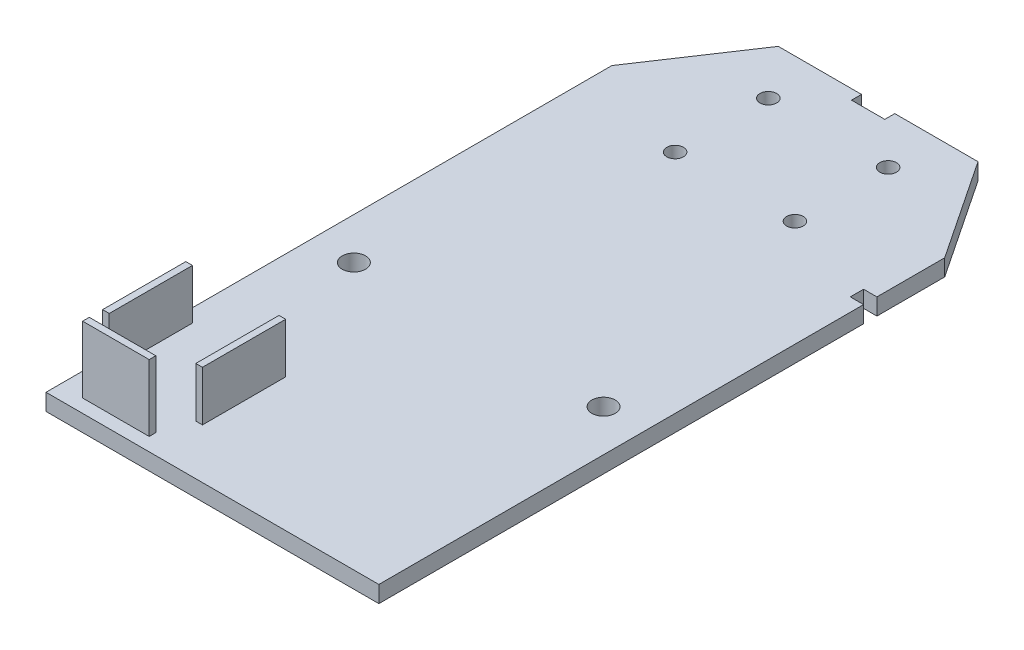
ISO-10303-21;
HEADER;
FILE_DESCRIPTION(('STEP AP214'),'2;1');
FILE_NAME('part.step','',(''),(''),'','','');
FILE_SCHEMA(('AUTOMOTIVE_DESIGN { 1 0 10303 214 1 1 1 1 }'));
ENDSEC;
DATA;
#1=APPLICATION_CONTEXT('core data for automotive mechanical design processes');
#2=APPLICATION_PROTOCOL_DEFINITION('international standard','automotive_design',2000,#1);
#3=PRODUCT_CONTEXT('',#1,'mechanical');
#4=PRODUCT('Part','Part','',(#3));
#5=PRODUCT_RELATED_PRODUCT_CATEGORY('part','',(#4));
#6=PRODUCT_DEFINITION_FORMATION('','',#4);
#7=PRODUCT_DEFINITION_CONTEXT('part definition',#1,'design');
#8=PRODUCT_DEFINITION('design','',#6,#7);
#9=PRODUCT_DEFINITION_SHAPE('','',#8);
#10=(LENGTH_UNIT() NAMED_UNIT(*) SI_UNIT(.MILLI.,.METRE.));
#11=(NAMED_UNIT(*) PLANE_ANGLE_UNIT() SI_UNIT($,.RADIAN.));
#12=(NAMED_UNIT(*) SI_UNIT($,.STERADIAN.) SOLID_ANGLE_UNIT());
#13=UNCERTAINTY_MEASURE_WITH_UNIT(LENGTH_MEASURE(1.E-05),#10,'distance_accuracy_value','');
#14=(GEOMETRIC_REPRESENTATION_CONTEXT(3) GLOBAL_UNCERTAINTY_ASSIGNED_CONTEXT((#13)) GLOBAL_UNIT_ASSIGNED_CONTEXT((#10,
#11,#12)) REPRESENTATION_CONTEXT('',''));
#15=CARTESIAN_POINT('',(0.,0.,0.));
#16=DIRECTION('',(0.,0.,1.));
#17=DIRECTION('',(1.,0.,0.));
#18=AXIS2_PLACEMENT_3D('',#15,#16,#17);
#19=CARTESIAN_POINT('',(7.,25.,-6.));
#20=DIRECTION('',(1.,0.,0.));
#21=DIRECTION('',(0.,0.,-1.));
#22=AXIS2_PLACEMENT_3D('',#19,#20,#21);
#23=PLANE('',#22);
#24=DIRECTION('',(0.,0.,1.));
#25=VECTOR('',#24,1.);
#26=CARTESIAN_POINT('',(7.,5.,-6.));
#27=LINE('',#26,#25);
#28=CARTESIAN_POINT('',(7.,5.,-6.));
#29=VERTEX_POINT('',#28);
#30=CARTESIAN_POINT('',(7.,5.,-4.));
#31=VERTEX_POINT('',#30);
#32=EDGE_CURVE('E106',#29,#31,#27,.T.);
#33=ORIENTED_EDGE('',*,*,#32,.T.);
#34=DIRECTION('',(0.,-1.,0.));
#35=VECTOR('',#34,1.);
#36=CARTESIAN_POINT('',(7.,25.,-4.));
#37=LINE('',#36,#35);
#38=CARTESIAN_POINT('',(7.,25.,-4.));
#39=VERTEX_POINT('',#38);
#40=EDGE_CURVE('E12',#39,#31,#37,.T.);
#41=ORIENTED_EDGE('',*,*,#40,.F.);
#42=DIRECTION('',(0.,0.,1.));
#43=VECTOR('',#42,1.);
#44=CARTESIAN_POINT('',(7.,25.,-6.));
#45=LINE('',#44,#43);
#46=CARTESIAN_POINT('',(7.,25.,-6.));
#47=VERTEX_POINT('',#46);
#48=EDGE_CURVE('E94',#47,#39,#45,.T.);
#49=ORIENTED_EDGE('',*,*,#48,.F.);
#50=DIRECTION('',(0.,-1.,0.));
#51=VECTOR('',#50,1.);
#52=CARTESIAN_POINT('',(7.,25.,-6.));
#53=LINE('',#52,#51);
#54=EDGE_CURVE('E102',#47,#29,#53,.T.);
#55=ORIENTED_EDGE('',*,*,#54,.T.);
#56=EDGE_LOOP('',(#33,#41,#49,#55));
#57=FACE_BOUND('',#56,.T.);
#58=ADVANCED_FACE('F43',(#57),#23,.F.);
#59=CARTESIAN_POINT('',(7.,25.,-4.));
#60=DIRECTION('',(0.,0.,-1.));
#61=DIRECTION('',(-1.,0.,0.));
#62=AXIS2_PLACEMENT_3D('',#59,#60,#61);
#63=PLANE('',#62);
#64=DIRECTION('',(1.,0.,0.));
#65=VECTOR('',#64,1.);
#66=CARTESIAN_POINT('',(7.,5.,-4.));
#67=LINE('',#66,#65);
#68=CARTESIAN_POINT('',(27.,5.,-4.));
#69=VERTEX_POINT('',#68);
#70=EDGE_CURVE('E98',#31,#69,#67,.T.);
#71=ORIENTED_EDGE('',*,*,#70,.T.);
#72=DIRECTION('',(0.,-1.,0.));
#73=VECTOR('',#72,1.);
#74=CARTESIAN_POINT('',(27.,25.,-4.));
#75=LINE('',#74,#73);
#76=CARTESIAN_POINT('',(27.,25.,-4.));
#77=VERTEX_POINT('',#76);
#78=EDGE_CURVE('E51',#77,#69,#75,.T.);
#79=ORIENTED_EDGE('',*,*,#78,.F.);
#80=DIRECTION('',(1.,0.,0.));
#81=VECTOR('',#80,1.);
#82=CARTESIAN_POINT('',(7.,25.,-4.));
#83=LINE('',#82,#81);
#84=EDGE_CURVE('E89',#39,#77,#83,.T.);
#85=ORIENTED_EDGE('',*,*,#84,.F.);
#86=ORIENTED_EDGE('',*,*,#40,.T.);
#87=EDGE_LOOP('',(#71,#79,#85,#86));
#88=FACE_BOUND('',#87,.T.);
#89=ADVANCED_FACE('F97',(#88),#63,.F.);
#90=CARTESIAN_POINT('',(27.,25.,-4.));
#91=DIRECTION('',(-1.,0.,0.));
#92=DIRECTION('',(0.,0.,1.));
#93=AXIS2_PLACEMENT_3D('',#90,#91,#92);
#94=PLANE('',#93);
#95=DIRECTION('',(0.,0.,-1.));
#96=VECTOR('',#95,1.);
#97=CARTESIAN_POINT('',(27.,5.,-4.));
#98=LINE('',#97,#96);
#99=CARTESIAN_POINT('',(27.,5.,-6.));
#100=VERTEX_POINT('',#99);
#101=EDGE_CURVE('E76',#69,#100,#98,.T.);
#102=ORIENTED_EDGE('',*,*,#101,.T.);
#103=DIRECTION('',(0.,-1.,0.));
#104=VECTOR('',#103,1.);
#105=CARTESIAN_POINT('',(27.,25.,-6.));
#106=LINE('',#105,#104);
#107=CARTESIAN_POINT('',(27.,25.,-6.));
#108=VERTEX_POINT('',#107);
#109=EDGE_CURVE('E99',#108,#100,#106,.T.);
#110=ORIENTED_EDGE('',*,*,#109,.F.);
#111=DIRECTION('',(0.,0.,-1.));
#112=VECTOR('',#111,1.);
#113=CARTESIAN_POINT('',(27.,25.,-4.));
#114=LINE('',#113,#112);
#115=EDGE_CURVE('E92',#77,#108,#114,.T.);
#116=ORIENTED_EDGE('',*,*,#115,.F.);
#117=ORIENTED_EDGE('',*,*,#78,.T.);
#118=EDGE_LOOP('',(#102,#110,#116,#117));
#119=FACE_BOUND('',#118,.T.);
#120=ADVANCED_FACE('F100',(#119),#94,.F.);
#121=CARTESIAN_POINT('',(27.,25.,-6.));
#122=DIRECTION('',(0.,0.,1.));
#123=DIRECTION('',(1.,0.,0.));
#124=AXIS2_PLACEMENT_3D('',#121,#122,#123);
#125=PLANE('',#124);
#126=DIRECTION('',(-1.,0.,0.));
#127=VECTOR('',#126,1.);
#128=CARTESIAN_POINT('',(27.,5.,-6.));
#129=LINE('',#128,#127);
#130=EDGE_CURVE('E82',#100,#29,#129,.T.);
#131=ORIENTED_EDGE('',*,*,#130,.T.);
#132=ORIENTED_EDGE('',*,*,#54,.F.);
#133=DIRECTION('',(-1.,0.,0.));
#134=VECTOR('',#133,1.);
#135=CARTESIAN_POINT('',(27.,25.,-6.));
#136=LINE('',#135,#134);
#137=EDGE_CURVE('E59',#108,#47,#136,.T.);
#138=ORIENTED_EDGE('',*,*,#137,.F.);
#139=ORIENTED_EDGE('',*,*,#109,.T.);
#140=EDGE_LOOP('',(#131,#132,#138,#139));
#141=FACE_BOUND('',#140,.T.);
#142=ADVANCED_FACE('F113',(#141),#125,.F.);
#143=CARTESIAN_POINT('',(0.,25.,0.));
#144=DIRECTION('',(0.,1.,0.));
#145=DIRECTION('',(0.,0.,1.));
#146=AXIS2_PLACEMENT_3D('',#143,#144,#145);
#147=PLANE('',#146);
#148=ORIENTED_EDGE('',*,*,#48,.T.);
#149=ORIENTED_EDGE('',*,*,#84,.T.);
#150=ORIENTED_EDGE('',*,*,#115,.T.);
#151=ORIENTED_EDGE('',*,*,#137,.T.);
#152=EDGE_LOOP('',(#148,#149,#150,#151));
#153=FACE_BOUND('',#152,.T.);
#154=ADVANCED_FACE('F90',(#153),#147,.T.);
#155=CARTESIAN_POINT('',(0.,5.,0.));
#156=DIRECTION('',(0.,1.,0.));
#157=DIRECTION('',(0.,0.,1.));
#158=AXIS2_PLACEMENT_3D('',#155,#156,#157);
#159=PLANE('',#158);
#160=ORIENTED_EDGE('',*,*,#32,.F.);
#161=ORIENTED_EDGE('',*,*,#130,.F.);
#162=ORIENTED_EDGE('',*,*,#101,.F.);
#163=ORIENTED_EDGE('',*,*,#70,.F.);
#164=EDGE_LOOP('',(#160,#161,#162,#163));
#165=FACE_BOUND('',#164,.T.);
#166=ADVANCED_FACE('F116',(#165),#159,.F.);
#167=CLOSED_SHELL('',(#58,#89,#120,#142,#154,#166));
#168=MANIFOLD_SOLID_BREP('B2',#167);
#169=CARTESIAN_POINT('',(0.,5.,0.));
#170=DIRECTION('',(0.,1.,0.));
#171=DIRECTION('',(0.,0.,1.));
#172=AXIS2_PLACEMENT_3D('',#169,#170,#171);
#173=PLANE('',#172);
#174=DIRECTION('',(1.,0.,0.));
#175=VECTOR('',#174,1.);
#176=CARTESIAN_POINT('',(96.,5.,-145.627138926997));
#177=LINE('',#176,#175);
#178=CARTESIAN_POINT('',(96.,5.,-145.627138926997));
#179=VERTEX_POINT('',#178);
#180=CARTESIAN_POINT('',(100.,5.,-145.627138926997));
#181=VERTEX_POINT('',#180);
#182=EDGE_CURVE('E377',#179,#181,#177,.T.);
#183=ORIENTED_EDGE('',*,*,#182,.F.);
#184=DIRECTION('',(0.,0.,1.));
#185=VECTOR('',#184,1.);
#186=CARTESIAN_POINT('',(96.,5.,-149.627138926997));
#187=LINE('',#186,#185);
#188=CARTESIAN_POINT('',(96.,5.,-149.627138926997));
#189=VERTEX_POINT('',#188);
#190=EDGE_CURVE('E386',#189,#179,#187,.T.);
#191=ORIENTED_EDGE('',*,*,#190,.F.);
#192=DIRECTION('',(-1.,0.,0.));
#193=VECTOR('',#192,1.);
#194=CARTESIAN_POINT('',(100.,5.,-149.627138926997));
#195=LINE('',#194,#193);
#196=CARTESIAN_POINT('',(100.,5.,-149.627138926997));
#197=VERTEX_POINT('',#196);
#198=EDGE_CURVE('E372',#197,#189,#195,.T.);
#199=ORIENTED_EDGE('',*,*,#198,.F.);
#200=DIRECTION('',(0.,0.,-1.));
#201=VECTOR('',#200,1.);
#202=CARTESIAN_POINT('',(100.,5.,0.));
#203=LINE('',#202,#201);
#204=CARTESIAN_POINT('',(100.,5.,-170.));
#205=VERTEX_POINT('',#204);
#206=EDGE_CURVE('E486',#197,#205,#203,.T.);
#207=ORIENTED_EDGE('',*,*,#206,.T.);
#208=DIRECTION('',(0.554700196225229,0.,0.832050294337843));
#209=VECTOR('',#208,1.);
#210=CARTESIAN_POINT('',(100.,5.,-170.));
#211=LINE('',#210,#209);
#212=CARTESIAN_POINT('',(80.,5.,-200.));
#213=VERTEX_POINT('',#212);
#214=EDGE_CURVE('E393',#213,#205,#211,.T.);
#215=ORIENTED_EDGE('',*,*,#214,.F.);
#216=DIRECTION('',(1.,0.,0.));
#217=VECTOR('',#216,1.);
#218=CARTESIAN_POINT('',(0.,5.,-200.));
#219=LINE('',#218,#217);
#220=CARTESIAN_POINT('',(55.,5.,-200.));
#221=VERTEX_POINT('',#220);
#222=EDGE_CURVE('E487',#221,#213,#219,.T.);
#223=ORIENTED_EDGE('',*,*,#222,.F.);
#224=DIRECTION('',(0.,0.,1.));
#225=VECTOR('',#224,1.);
#226=CARTESIAN_POINT('',(55.,5.,-200.));
#227=LINE('',#226,#225);
#228=CARTESIAN_POINT('',(55.,5.,-197.));
#229=VERTEX_POINT('',#228);
#230=EDGE_CURVE('E424',#221,#229,#227,.T.);
#231=ORIENTED_EDGE('',*,*,#230,.T.);
#232=DIRECTION('',(1.,0.,0.));
#233=VECTOR('',#232,1.);
#234=CARTESIAN_POINT('',(45.,5.,-197.));
#235=LINE('',#234,#233);
#236=CARTESIAN_POINT('',(45.,5.,-197.));
#237=VERTEX_POINT('',#236);
#238=EDGE_CURVE('E433',#237,#229,#235,.T.);
#239=ORIENTED_EDGE('',*,*,#238,.F.);
#240=DIRECTION('',(0.,0.,1.));
#241=VECTOR('',#240,1.);
#242=CARTESIAN_POINT('',(45.,5.,-200.));
#243=LINE('',#242,#241);
#244=CARTESIAN_POINT('',(45.,5.,-200.));
#245=VERTEX_POINT('',#244);
#246=EDGE_CURVE('E409',#245,#237,#243,.T.);
#247=ORIENTED_EDGE('',*,*,#246,.F.);
#248=CARTESIAN_POINT('',(20.,5.,-200.));
#249=VERTEX_POINT('',#248);
#250=EDGE_CURVE('E484',#249,#245,#219,.T.);
#251=ORIENTED_EDGE('',*,*,#250,.F.);
#252=DIRECTION('',(0.554700196225229,0.,-0.832050294337844));
#253=VECTOR('',#252,1.);
#254=CARTESIAN_POINT('',(0.,5.,-170.));
#255=LINE('',#254,#253);
#256=CARTESIAN_POINT('',(0.,5.,-170.));
#257=VERTEX_POINT('',#256);
#258=EDGE_CURVE('E403',#257,#249,#255,.T.);
#259=ORIENTED_EDGE('',*,*,#258,.F.);
#260=DIRECTION('',(0.,0.,-1.));
#261=VECTOR('',#260,1.);
#262=CARTESIAN_POINT('',(0.,5.,0.));
#263=LINE('',#262,#261);
#264=CARTESIAN_POINT('',(0.,5.,0.));
#265=VERTEX_POINT('',#264);
#266=EDGE_CURVE('E493',#265,#257,#263,.T.);
#267=ORIENTED_EDGE('',*,*,#266,.F.);
#268=DIRECTION('',(1.,0.,0.));
#269=VECTOR('',#268,1.);
#270=CARTESIAN_POINT('',(0.,5.,0.));
#271=LINE('',#270,#269);
#272=CARTESIAN_POINT('',(100.,5.,0.));
#273=VERTEX_POINT('',#272);
#274=EDGE_CURVE('E491',#265,#273,#271,.T.);
#275=ORIENTED_EDGE('',*,*,#274,.T.);
#276=EDGE_CURVE('E488',#273,#181,#203,.T.);
#277=ORIENTED_EDGE('',*,*,#276,.T.);
#278=EDGE_LOOP('',(#183,#191,#199,#207,#215,#223,#231,#239,#247,#251,#259,#267,#275,#277));
#279=FACE_BOUND('',#278,.T.);
#280=CARTESIAN_POINT('',(12.5,5.,-80.));
#281=DIRECTION('',(0.,1.,0.));
#282=DIRECTION('',(0.,0.,1.));
#283=AXIS2_PLACEMENT_3D('',#280,#281,#282);
#284=CIRCLE('',#283,3.5);
#285=CARTESIAN_POINT('',(12.5,5.,-76.5));
#286=VERTEX_POINT('',#285);
#287=EDGE_CURVE('E452',#286,#286,#284,.T.);
#288=ORIENTED_EDGE('',*,*,#287,.F.);
#289=EDGE_LOOP('',(#288));
#290=FACE_BOUND('',#289,.T.);
#291=CARTESIAN_POINT('',(87.5,5.,-80.));
#292=DIRECTION('',(0.,1.,0.));
#293=DIRECTION('',(0.,0.,1.));
#294=AXIS2_PLACEMENT_3D('',#291,#292,#293);
#295=CIRCLE('',#294,3.50000000000001);
#296=CARTESIAN_POINT('',(87.5,5.,-76.5));
#297=VERTEX_POINT('',#296);
#298=EDGE_CURVE('E441',#297,#297,#295,.T.);
#299=ORIENTED_EDGE('',*,*,#298,.F.);
#300=EDGE_LOOP('',(#299));
#301=FACE_BOUND('',#300,.T.);
#302=CARTESIAN_POINT('',(68.,5.,-185.));
#303=DIRECTION('',(0.,1.,0.));
#304=DIRECTION('',(0.,0.,1.));
#305=AXIS2_PLACEMENT_3D('',#302,#303,#304);
#306=CIRCLE('',#305,2.5);
#307=CARTESIAN_POINT('',(68.,5.,-182.5));
#308=VERTEX_POINT('',#307);
#309=EDGE_CURVE('E470',#308,#308,#306,.T.);
#310=ORIENTED_EDGE('',*,*,#309,.F.);
#311=EDGE_LOOP('',(#310));
#312=FACE_BOUND('',#311,.T.);
#313=CARTESIAN_POINT('',(32.,5.,-157.));
#314=DIRECTION('',(0.,1.,0.));
#315=DIRECTION('',(0.,0.,1.));
#316=AXIS2_PLACEMENT_3D('',#313,#314,#315);
#317=CIRCLE('',#316,2.5);
#318=CARTESIAN_POINT('',(32.,5.,-154.5));
#319=VERTEX_POINT('',#318);
#320=EDGE_CURVE('E463',#319,#319,#317,.T.);
#321=ORIENTED_EDGE('',*,*,#320,.F.);
#322=EDGE_LOOP('',(#321));
#323=FACE_BOUND('',#322,.T.);
#324=CARTESIAN_POINT('',(68.,5.,-157.));
#325=DIRECTION('',(0.,1.,0.));
#326=DIRECTION('',(0.,0.,1.));
#327=AXIS2_PLACEMENT_3D('',#324,#325,#326);
#328=CIRCLE('',#327,2.5);
#329=CARTESIAN_POINT('',(68.,5.,-154.5));
#330=VERTEX_POINT('',#329);
#331=EDGE_CURVE('E451',#330,#330,#328,.T.);
#332=ORIENTED_EDGE('',*,*,#331,.F.);
#333=EDGE_LOOP('',(#332));
#334=FACE_BOUND('',#333,.T.);
#335=CARTESIAN_POINT('',(32.,5.,-185.));
#336=DIRECTION('',(0.,1.,0.));
#337=DIRECTION('',(0.,0.,1.));
#338=AXIS2_PLACEMENT_3D('',#335,#336,#337);
#339=CIRCLE('',#338,2.5);
#340=CARTESIAN_POINT('',(32.,5.,-182.5));
#341=VERTEX_POINT('',#340);
#342=EDGE_CURVE('E469',#341,#341,#339,.T.);
#343=ORIENTED_EDGE('',*,*,#342,.F.);
#344=EDGE_LOOP('',(#343));
#345=FACE_BOUND('',#344,.T.);
#346=DIRECTION('',(0.,0.,-1.));
#347=VECTOR('',#346,1.);
#348=CARTESIAN_POINT('',(32.,5.,-40.));
#349=LINE('',#348,#347);
#350=CARTESIAN_POINT('',(32.,5.,-15.));
#351=VERTEX_POINT('',#350);
#352=CARTESIAN_POINT('',(32.,5.,-40.));
#353=VERTEX_POINT('',#352);
#354=EDGE_CURVE('E344',#351,#353,#349,.T.);
#355=ORIENTED_EDGE('',*,*,#354,.F.);
#356=DIRECTION('',(1.,0.,0.));
#357=VECTOR('',#356,1.);
#358=CARTESIAN_POINT('',(32.,5.,-15.));
#359=LINE('',#358,#357);
#360=CARTESIAN_POINT('',(30.,5.,-15.));
#361=VERTEX_POINT('',#360);
#362=EDGE_CURVE('E341',#361,#351,#359,.T.);
#363=ORIENTED_EDGE('',*,*,#362,.F.);
#364=DIRECTION('',(0.,0.,1.));
#365=VECTOR('',#364,1.);
#366=CARTESIAN_POINT('',(30.,5.,-15.));
#367=LINE('',#366,#365);
#368=CARTESIAN_POINT('',(30.,5.,-40.));
#369=VERTEX_POINT('',#368);
#370=EDGE_CURVE('E353',#369,#361,#367,.T.);
#371=ORIENTED_EDGE('',*,*,#370,.F.);
#372=DIRECTION('',(-1.,0.,0.));
#373=VECTOR('',#372,1.);
#374=CARTESIAN_POINT('',(30.,5.,-40.));
#375=LINE('',#374,#373);
#376=EDGE_CURVE('E361',#353,#369,#375,.T.);
#377=ORIENTED_EDGE('',*,*,#376,.F.);
#378=EDGE_LOOP('',(#355,#363,#371,#377));
#379=FACE_BOUND('',#378,.T.);
#380=DIRECTION('',(-1.,0.,0.));
#381=VECTOR('',#380,1.);
#382=CARTESIAN_POINT('',(4.,5.,-40.));
#383=LINE('',#382,#381);
#384=CARTESIAN_POINT('',(4.,5.,-40.));
#385=VERTEX_POINT('',#384);
#386=CARTESIAN_POINT('',(2.00000000000001,5.,-40.));
#387=VERTEX_POINT('',#386);
#388=EDGE_CURVE('E799',#385,#387,#383,.T.);
#389=ORIENTED_EDGE('',*,*,#388,.F.);
#390=DIRECTION('',(0.,0.,-1.));
#391=VECTOR('',#390,1.);
#392=CARTESIAN_POINT('',(4.,5.,-15.));
#393=LINE('',#392,#391);
#394=CARTESIAN_POINT('',(4.,5.,-15.));
#395=VERTEX_POINT('',#394);
#396=EDGE_CURVE('E339',#395,#385,#393,.T.);
#397=ORIENTED_EDGE('',*,*,#396,.F.);
#398=DIRECTION('',(1.,0.,0.));
#399=VECTOR('',#398,1.);
#400=CARTESIAN_POINT('',(2.,5.,-15.));
#401=LINE('',#400,#399);
#402=CARTESIAN_POINT('',(2.,5.,-15.));
#403=VERTEX_POINT('',#402);
#404=EDGE_CURVE('E335',#403,#395,#401,.T.);
#405=ORIENTED_EDGE('',*,*,#404,.F.);
#406=DIRECTION('',(0.,0.,1.));
#407=VECTOR('',#406,1.);
#408=CARTESIAN_POINT('',(2.00000000000001,5.,-40.));
#409=LINE('',#408,#407);
#410=EDGE_CURVE('E796',#387,#403,#409,.T.);
#411=ORIENTED_EDGE('',*,*,#410,.F.);
#412=EDGE_LOOP('',(#389,#397,#405,#411));
#413=FACE_BOUND('',#412,.T.);
#414=ADVANCED_FACE('F167',(#279,#290,#301,#312,#323,#334,#345,#379,#413),#173,.T.);
#415=CARTESIAN_POINT('',(100.,5.,0.));
#416=DIRECTION('',(-1.,0.,0.));
#417=DIRECTION('',(0.,0.,1.));
#418=AXIS2_PLACEMENT_3D('',#415,#416,#417);
#419=PLANE('',#418);
#420=DIRECTION('',(0.,0.,-1.));
#421=VECTOR('',#420,1.);
#422=CARTESIAN_POINT('',(100.,0.,0.));
#423=LINE('',#422,#421);
#424=CARTESIAN_POINT('',(100.,0.,0.));
#425=VERTEX_POINT('',#424);
#426=CARTESIAN_POINT('',(100.,0.,-145.627138926997));
#427=VERTEX_POINT('',#426);
#428=EDGE_CURVE('E499',#425,#427,#423,.T.);
#429=ORIENTED_EDGE('',*,*,#428,.T.);
#430=DIRECTION('',(0.,1.,0.));
#431=VECTOR('',#430,1.);
#432=CARTESIAN_POINT('',(100.,0.,-145.627138926997));
#433=LINE('',#432,#431);
#434=EDGE_CURVE('E390',#427,#181,#433,.T.);
#435=ORIENTED_EDGE('',*,*,#434,.T.);
#436=ORIENTED_EDGE('',*,*,#276,.F.);
#437=DIRECTION('',(0.,-1.,0.));
#438=VECTOR('',#437,1.);
#439=CARTESIAN_POINT('',(100.,5.,0.));
#440=LINE('',#439,#438);
#441=EDGE_CURVE('E171',#273,#425,#440,.T.);
#442=ORIENTED_EDGE('',*,*,#441,.T.);
#443=EDGE_LOOP('',(#429,#435,#436,#442));
#444=FACE_BOUND('',#443,.T.);
#445=ADVANCED_FACE('F560',(#444),#419,.F.);
#446=CARTESIAN_POINT('',(0.,5.,-200.));
#447=DIRECTION('',(0.,0.,-1.));
#448=DIRECTION('',(-1.,0.,0.));
#449=AXIS2_PLACEMENT_3D('',#446,#447,#448);
#450=PLANE('',#449);
#451=DIRECTION('',(0.,1.,0.));
#452=VECTOR('',#451,1.);
#453=CARTESIAN_POINT('',(80.,0.,-200.));
#454=LINE('',#453,#452);
#455=CARTESIAN_POINT('',(80.,0.,-200.));
#456=VERTEX_POINT('',#455);
#457=EDGE_CURVE('E414',#456,#213,#454,.T.);
#458=ORIENTED_EDGE('',*,*,#457,.F.);
#459=DIRECTION('',(1.,0.,0.));
#460=VECTOR('',#459,1.);
#461=CARTESIAN_POINT('',(0.,0.,-200.));
#462=LINE('',#461,#460);
#463=CARTESIAN_POINT('',(55.,0.,-200.));
#464=VERTEX_POINT('',#463);
#465=EDGE_CURVE('E481',#464,#456,#462,.T.);
#466=ORIENTED_EDGE('',*,*,#465,.F.);
#467=DIRECTION('',(0.,1.,0.));
#468=VECTOR('',#467,1.);
#469=CARTESIAN_POINT('',(55.,0.,-200.));
#470=LINE('',#469,#468);
#471=EDGE_CURVE('E442',#464,#221,#470,.T.);
#472=ORIENTED_EDGE('',*,*,#471,.T.);
#473=ORIENTED_EDGE('',*,*,#222,.T.);
#474=EDGE_LOOP('',(#458,#466,#472,#473));
#475=FACE_BOUND('',#474,.T.);
#476=ADVANCED_FACE('F513',(#475),#450,.T.);
#477=DIRECTION('',(0.,1.,0.));
#478=VECTOR('',#477,1.);
#479=CARTESIAN_POINT('',(20.,0.,-200.));
#480=LINE('',#479,#478);
#481=CARTESIAN_POINT('',(20.,0.,-200.));
#482=VERTEX_POINT('',#481);
#483=EDGE_CURVE('E406',#482,#249,#480,.T.);
#484=ORIENTED_EDGE('',*,*,#483,.T.);
#485=ORIENTED_EDGE('',*,*,#250,.T.);
#486=DIRECTION('',(0.,1.,0.));
#487=VECTOR('',#486,1.);
#488=CARTESIAN_POINT('',(45.,0.,-200.));
#489=LINE('',#488,#487);
#490=CARTESIAN_POINT('',(45.,0.,-200.));
#491=VERTEX_POINT('',#490);
#492=EDGE_CURVE('E438',#491,#245,#489,.T.);
#493=ORIENTED_EDGE('',*,*,#492,.F.);
#494=EDGE_CURVE('E496',#482,#491,#462,.T.);
#495=ORIENTED_EDGE('',*,*,#494,.F.);
#496=EDGE_LOOP('',(#484,#485,#493,#495));
#497=FACE_BOUND('',#496,.T.);
#498=ADVANCED_FACE('F169',(#497),#450,.T.);
#499=CARTESIAN_POINT('',(0.,5.,0.));
#500=DIRECTION('',(-1.,0.,0.));
#501=DIRECTION('',(0.,0.,1.));
#502=AXIS2_PLACEMENT_3D('',#499,#500,#501);
#503=PLANE('',#502);
#504=DIRECTION('',(0.,1.,0.));
#505=VECTOR('',#504,1.);
#506=CARTESIAN_POINT('',(0.,0.,-170.));
#507=LINE('',#506,#505);
#508=CARTESIAN_POINT('',(0.,0.,-170.));
#509=VERTEX_POINT('',#508);
#510=EDGE_CURVE('E402',#509,#257,#507,.T.);
#511=ORIENTED_EDGE('',*,*,#510,.F.);
#512=DIRECTION('',(0.,0.,-1.));
#513=VECTOR('',#512,1.);
#514=CARTESIAN_POINT('',(0.,0.,0.));
#515=LINE('',#514,#513);
#516=CARTESIAN_POINT('',(0.,0.,0.));
#517=VERTEX_POINT('',#516);
#518=EDGE_CURVE('E504',#517,#509,#515,.T.);
#519=ORIENTED_EDGE('',*,*,#518,.F.);
#520=DIRECTION('',(0.,-1.,0.));
#521=VECTOR('',#520,1.);
#522=CARTESIAN_POINT('',(0.,5.,0.));
#523=LINE('',#522,#521);
#524=EDGE_CURVE('E41',#265,#517,#523,.T.);
#525=ORIENTED_EDGE('',*,*,#524,.F.);
#526=ORIENTED_EDGE('',*,*,#266,.T.);
#527=EDGE_LOOP('',(#511,#519,#525,#526));
#528=FACE_BOUND('',#527,.T.);
#529=ADVANCED_FACE('F551',(#528),#503,.T.);
#530=CARTESIAN_POINT('',(0.,5.,0.));
#531=DIRECTION('',(0.,0.,-1.));
#532=DIRECTION('',(-1.,0.,0.));
#533=AXIS2_PLACEMENT_3D('',#530,#531,#532);
#534=PLANE('',#533);
#535=DIRECTION('',(1.,0.,0.));
#536=VECTOR('',#535,1.);
#537=CARTESIAN_POINT('',(0.,0.,0.));
#538=LINE('',#537,#536);
#539=EDGE_CURVE('E502',#517,#425,#538,.T.);
#540=ORIENTED_EDGE('',*,*,#539,.T.);
#541=ORIENTED_EDGE('',*,*,#441,.F.);
#542=ORIENTED_EDGE('',*,*,#274,.F.);
#543=ORIENTED_EDGE('',*,*,#524,.T.);
#544=EDGE_LOOP('',(#540,#541,#542,#543));
#545=FACE_BOUND('',#544,.T.);
#546=ADVANCED_FACE('F555',(#545),#534,.F.);
#547=ORIENTED_EDGE('',*,*,#206,.F.);
#548=DIRECTION('',(0.,1.,0.));
#549=VECTOR('',#548,1.);
#550=CARTESIAN_POINT('',(100.,0.,-149.627138926997));
#551=LINE('',#550,#549);
#552=CARTESIAN_POINT('',(100.,0.,-149.627138926997));
#553=VERTEX_POINT('',#552);
#554=EDGE_CURVE('E383',#553,#197,#551,.T.);
#555=ORIENTED_EDGE('',*,*,#554,.F.);
#556=CARTESIAN_POINT('',(100.,0.,-170.));
#557=VERTEX_POINT('',#556);
#558=EDGE_CURVE('E498',#553,#557,#423,.T.);
#559=ORIENTED_EDGE('',*,*,#558,.T.);
#560=DIRECTION('',(0.,1.,0.));
#561=VECTOR('',#560,1.);
#562=CARTESIAN_POINT('',(100.,0.,-170.));
#563=LINE('',#562,#561);
#564=EDGE_CURVE('E405',#557,#205,#563,.T.);
#565=ORIENTED_EDGE('',*,*,#564,.T.);
#566=EDGE_LOOP('',(#547,#555,#559,#565));
#567=FACE_BOUND('',#566,.T.);
#568=ADVANCED_FACE('F527',(#567),#419,.F.);
#569=CARTESIAN_POINT('',(0.,0.,0.));
#570=DIRECTION('',(0.,1.,0.));
#571=DIRECTION('',(0.,0.,1.));
#572=AXIS2_PLACEMENT_3D('',#569,#570,#571);
#573=PLANE('',#572);
#574=CARTESIAN_POINT('',(12.5,0.,-80.));
#575=DIRECTION('',(0.,1.,0.));
#576=DIRECTION('',(0.,0.,1.));
#577=AXIS2_PLACEMENT_3D('',#574,#575,#576);
#578=CIRCLE('',#577,3.5);
#579=CARTESIAN_POINT('',(12.5,0.,-76.5));
#580=VERTEX_POINT('',#579);
#581=EDGE_CURVE('E448',#580,#580,#578,.T.);
#582=ORIENTED_EDGE('',*,*,#581,.T.);
#583=EDGE_LOOP('',(#582));
#584=FACE_BOUND('',#583,.T.);
#585=CARTESIAN_POINT('',(87.5,0.,-80.));
#586=DIRECTION('',(0.,1.,0.));
#587=DIRECTION('',(0.,0.,1.));
#588=AXIS2_PLACEMENT_3D('',#585,#586,#587);
#589=CIRCLE('',#588,3.50000000000001);
#590=CARTESIAN_POINT('',(87.5,0.,-76.5));
#591=VERTEX_POINT('',#590);
#592=EDGE_CURVE('E455',#591,#591,#589,.T.);
#593=ORIENTED_EDGE('',*,*,#592,.T.);
#594=EDGE_LOOP('',(#593));
#595=FACE_BOUND('',#594,.T.);
#596=CARTESIAN_POINT('',(68.,0.,-185.));
#597=DIRECTION('',(0.,1.,0.));
#598=DIRECTION('',(0.,0.,1.));
#599=AXIS2_PLACEMENT_3D('',#596,#597,#598);
#600=CIRCLE('',#599,2.5);
#601=CARTESIAN_POINT('',(68.,0.,-182.5));
#602=VERTEX_POINT('',#601);
#603=EDGE_CURVE('E466',#602,#602,#600,.T.);
#604=ORIENTED_EDGE('',*,*,#603,.T.);
#605=EDGE_LOOP('',(#604));
#606=FACE_BOUND('',#605,.T.);
#607=CARTESIAN_POINT('',(32.,0.,-157.));
#608=DIRECTION('',(0.,1.,0.));
#609=DIRECTION('',(0.,0.,1.));
#610=AXIS2_PLACEMENT_3D('',#607,#608,#609);
#611=CIRCLE('',#610,2.5);
#612=CARTESIAN_POINT('',(32.,0.,-154.5));
#613=VERTEX_POINT('',#612);
#614=EDGE_CURVE('E473',#613,#613,#611,.T.);
#615=ORIENTED_EDGE('',*,*,#614,.T.);
#616=EDGE_LOOP('',(#615));
#617=FACE_BOUND('',#616,.T.);
#618=CARTESIAN_POINT('',(68.,0.,-157.));
#619=DIRECTION('',(0.,1.,0.));
#620=DIRECTION('',(0.,0.,1.));
#621=AXIS2_PLACEMENT_3D('',#618,#619,#620);
#622=CIRCLE('',#621,2.5);
#623=CARTESIAN_POINT('',(68.,0.,-154.5));
#624=VERTEX_POINT('',#623);
#625=EDGE_CURVE('E460',#624,#624,#622,.T.);
#626=ORIENTED_EDGE('',*,*,#625,.T.);
#627=EDGE_LOOP('',(#626));
#628=FACE_BOUND('',#627,.T.);
#629=CARTESIAN_POINT('',(32.,0.,-185.));
#630=DIRECTION('',(0.,1.,0.));
#631=DIRECTION('',(0.,0.,1.));
#632=AXIS2_PLACEMENT_3D('',#629,#630,#631);
#633=CIRCLE('',#632,2.5);
#634=CARTESIAN_POINT('',(32.,0.,-182.5));
#635=VERTEX_POINT('',#634);
#636=EDGE_CURVE('E478',#635,#635,#633,.T.);
#637=ORIENTED_EDGE('',*,*,#636,.T.);
#638=EDGE_LOOP('',(#637));
#639=FACE_BOUND('',#638,.T.);
#640=DIRECTION('',(0.,0.,1.));
#641=VECTOR('',#640,1.);
#642=CARTESIAN_POINT('',(96.,0.,-149.627138926997));
#643=LINE('',#642,#641);
#644=CARTESIAN_POINT('',(96.,0.,-149.627138926997));
#645=VERTEX_POINT('',#644);
#646=CARTESIAN_POINT('',(96.,0.,-145.627138926997));
#647=VERTEX_POINT('',#646);
#648=EDGE_CURVE('E376',#645,#647,#643,.T.);
#649=ORIENTED_EDGE('',*,*,#648,.T.);
#650=DIRECTION('',(1.,0.,0.));
#651=VECTOR('',#650,1.);
#652=CARTESIAN_POINT('',(96.,0.,-145.627138926997));
#653=LINE('',#652,#651);
#654=EDGE_CURVE('E380',#647,#427,#653,.T.);
#655=ORIENTED_EDGE('',*,*,#654,.T.);
#656=ORIENTED_EDGE('',*,*,#428,.F.);
#657=ORIENTED_EDGE('',*,*,#539,.F.);
#658=ORIENTED_EDGE('',*,*,#518,.T.);
#659=DIRECTION('',(0.554700196225229,0.,-0.832050294337844));
#660=VECTOR('',#659,1.);
#661=CARTESIAN_POINT('',(0.,0.,-170.));
#662=LINE('',#661,#660);
#663=EDGE_CURVE('E399',#509,#482,#662,.T.);
#664=ORIENTED_EDGE('',*,*,#663,.T.);
#665=ORIENTED_EDGE('',*,*,#494,.T.);
#666=DIRECTION('',(0.,0.,1.));
#667=VECTOR('',#666,1.);
#668=CARTESIAN_POINT('',(45.,0.,-200.));
#669=LINE('',#668,#667);
#670=CARTESIAN_POINT('',(45.,0.,-197.));
#671=VERTEX_POINT('',#670);
#672=EDGE_CURVE('E420',#491,#671,#669,.T.);
#673=ORIENTED_EDGE('',*,*,#672,.T.);
#674=DIRECTION('',(1.,0.,0.));
#675=VECTOR('',#674,1.);
#676=CARTESIAN_POINT('',(45.,0.,-197.));
#677=LINE('',#676,#675);
#678=CARTESIAN_POINT('',(55.,0.,-197.));
#679=VERTEX_POINT('',#678);
#680=EDGE_CURVE('E423',#671,#679,#677,.T.);
#681=ORIENTED_EDGE('',*,*,#680,.T.);
#682=DIRECTION('',(0.,0.,1.));
#683=VECTOR('',#682,1.);
#684=CARTESIAN_POINT('',(55.,0.,-200.));
#685=LINE('',#684,#683);
#686=EDGE_CURVE('E427',#464,#679,#685,.T.);
#687=ORIENTED_EDGE('',*,*,#686,.F.);
#688=ORIENTED_EDGE('',*,*,#465,.T.);
#689=DIRECTION('',(0.554700196225229,0.,0.832050294337843));
#690=VECTOR('',#689,1.);
#691=CARTESIAN_POINT('',(100.,0.,-170.));
#692=LINE('',#691,#690);
#693=EDGE_CURVE('E411',#456,#557,#692,.T.);
#694=ORIENTED_EDGE('',*,*,#693,.T.);
#695=ORIENTED_EDGE('',*,*,#558,.F.);
#696=DIRECTION('',(-1.,0.,0.));
#697=VECTOR('',#696,1.);
#698=CARTESIAN_POINT('',(100.,0.,-149.627138926997));
#699=LINE('',#698,#697);
#700=EDGE_CURVE('E373',#553,#645,#699,.T.);
#701=ORIENTED_EDGE('',*,*,#700,.T.);
#702=EDGE_LOOP('',(#649,#655,#656,#657,#658,#664,#665,#673,#681,#687,#688,#694,#695,#701));
#703=FACE_BOUND('',#702,.T.);
#704=ADVANCED_FACE('F530',(#584,#595,#606,#617,#628,#639,#703),#573,.F.);
#705=CARTESIAN_POINT('',(32.,0.,-185.));
#706=DIRECTION('',(0.,1.,0.));
#707=DIRECTION('',(0.,0.,1.));
#708=AXIS2_PLACEMENT_3D('',#705,#706,#707);
#709=CYLINDRICAL_SURFACE('',#708,2.5);
#710=ORIENTED_EDGE('',*,*,#636,.F.);
#711=EDGE_LOOP('',(#710));
#712=FACE_BOUND('',#711,.T.);
#713=ORIENTED_EDGE('',*,*,#342,.T.);
#714=EDGE_LOOP('',(#713));
#715=FACE_BOUND('',#714,.T.);
#716=ADVANCED_FACE('F589',(#712,#715),#709,.F.);
#717=CARTESIAN_POINT('',(68.,0.,-157.));
#718=DIRECTION('',(0.,1.,0.));
#719=DIRECTION('',(0.,0.,1.));
#720=AXIS2_PLACEMENT_3D('',#717,#718,#719);
#721=CYLINDRICAL_SURFACE('',#720,2.5);
#722=ORIENTED_EDGE('',*,*,#625,.F.);
#723=EDGE_LOOP('',(#722));
#724=FACE_BOUND('',#723,.T.);
#725=ORIENTED_EDGE('',*,*,#331,.T.);
#726=EDGE_LOOP('',(#725));
#727=FACE_BOUND('',#726,.T.);
#728=ADVANCED_FACE('F614',(#724,#727),#721,.F.);
#729=CARTESIAN_POINT('',(32.,0.,-157.));
#730=DIRECTION('',(0.,1.,0.));
#731=DIRECTION('',(0.,0.,1.));
#732=AXIS2_PLACEMENT_3D('',#729,#730,#731);
#733=CYLINDRICAL_SURFACE('',#732,2.5);
#734=ORIENTED_EDGE('',*,*,#614,.F.);
#735=EDGE_LOOP('',(#734));
#736=FACE_BOUND('',#735,.T.);
#737=ORIENTED_EDGE('',*,*,#320,.T.);
#738=EDGE_LOOP('',(#737));
#739=FACE_BOUND('',#738,.T.);
#740=ADVANCED_FACE('F621',(#736,#739),#733,.F.);
#741=CARTESIAN_POINT('',(68.,0.,-185.));
#742=DIRECTION('',(0.,1.,0.));
#743=DIRECTION('',(0.,0.,1.));
#744=AXIS2_PLACEMENT_3D('',#741,#742,#743);
#745=CYLINDRICAL_SURFACE('',#744,2.5);
#746=ORIENTED_EDGE('',*,*,#603,.F.);
#747=EDGE_LOOP('',(#746));
#748=FACE_BOUND('',#747,.T.);
#749=ORIENTED_EDGE('',*,*,#309,.T.);
#750=EDGE_LOOP('',(#749));
#751=FACE_BOUND('',#750,.T.);
#752=ADVANCED_FACE('F629',(#748,#751),#745,.F.);
#753=CARTESIAN_POINT('',(87.5,0.,-80.));
#754=DIRECTION('',(0.,1.,0.));
#755=DIRECTION('',(0.,0.,1.));
#756=AXIS2_PLACEMENT_3D('',#753,#754,#755);
#757=CYLINDRICAL_SURFACE('',#756,3.50000000000001);
#758=ORIENTED_EDGE('',*,*,#592,.F.);
#759=EDGE_LOOP('',(#758));
#760=FACE_BOUND('',#759,.T.);
#761=ORIENTED_EDGE('',*,*,#298,.T.);
#762=EDGE_LOOP('',(#761));
#763=FACE_BOUND('',#762,.T.);
#764=ADVANCED_FACE('F636',(#760,#763),#757,.F.);
#765=CARTESIAN_POINT('',(12.5,0.,-80.));
#766=DIRECTION('',(0.,1.,0.));
#767=DIRECTION('',(0.,0.,1.));
#768=AXIS2_PLACEMENT_3D('',#765,#766,#767);
#769=CYLINDRICAL_SURFACE('',#768,3.5);
#770=ORIENTED_EDGE('',*,*,#581,.F.);
#771=EDGE_LOOP('',(#770));
#772=FACE_BOUND('',#771,.T.);
#773=ORIENTED_EDGE('',*,*,#287,.T.);
#774=EDGE_LOOP('',(#773));
#775=FACE_BOUND('',#774,.T.);
#776=ADVANCED_FACE('F644',(#772,#775),#769,.F.);
#777=CARTESIAN_POINT('',(45.,0.,-200.));
#778=DIRECTION('',(-1.,0.,0.));
#779=DIRECTION('',(0.,0.,1.));
#780=AXIS2_PLACEMENT_3D('',#777,#778,#779);
#781=PLANE('',#780);
#782=ORIENTED_EDGE('',*,*,#246,.T.);
#783=DIRECTION('',(0.,1.,0.));
#784=VECTOR('',#783,1.);
#785=CARTESIAN_POINT('',(45.,0.,-197.));
#786=LINE('',#785,#784);
#787=EDGE_CURVE('E430',#671,#237,#786,.T.);
#788=ORIENTED_EDGE('',*,*,#787,.F.);
#789=ORIENTED_EDGE('',*,*,#672,.F.);
#790=ORIENTED_EDGE('',*,*,#492,.T.);
#791=EDGE_LOOP('',(#782,#788,#789,#790));
#792=FACE_BOUND('',#791,.T.);
#793=ADVANCED_FACE('F541',(#792),#781,.F.);
#794=CARTESIAN_POINT('',(55.,0.,-200.));
#795=DIRECTION('',(-1.,0.,0.));
#796=DIRECTION('',(0.,0.,1.));
#797=AXIS2_PLACEMENT_3D('',#794,#795,#796);
#798=PLANE('',#797);
#799=ORIENTED_EDGE('',*,*,#230,.F.);
#800=ORIENTED_EDGE('',*,*,#471,.F.);
#801=ORIENTED_EDGE('',*,*,#686,.T.);
#802=DIRECTION('',(0.,1.,0.));
#803=VECTOR('',#802,1.);
#804=CARTESIAN_POINT('',(55.,0.,-197.));
#805=LINE('',#804,#803);
#806=EDGE_CURVE('E445',#679,#229,#805,.T.);
#807=ORIENTED_EDGE('',*,*,#806,.T.);
#808=EDGE_LOOP('',(#799,#800,#801,#807));
#809=FACE_BOUND('',#808,.T.);
#810=ADVANCED_FACE('F534',(#809),#798,.T.);
#811=CARTESIAN_POINT('',(45.,0.,-197.));
#812=DIRECTION('',(0.,0.,1.));
#813=DIRECTION('',(1.,0.,0.));
#814=AXIS2_PLACEMENT_3D('',#811,#812,#813);
#815=PLANE('',#814);
#816=ORIENTED_EDGE('',*,*,#238,.T.);
#817=ORIENTED_EDGE('',*,*,#806,.F.);
#818=ORIENTED_EDGE('',*,*,#680,.F.);
#819=ORIENTED_EDGE('',*,*,#787,.T.);
#820=EDGE_LOOP('',(#816,#817,#818,#819));
#821=FACE_BOUND('',#820,.T.);
#822=ADVANCED_FACE('F536',(#821),#815,.F.);
#823=CARTESIAN_POINT('',(100.,0.,-170.));
#824=DIRECTION('',(-0.832050294337844,0.,0.554700196225229));
#825=DIRECTION('',(0.554700196225229,0.,0.832050294337844));
#826=AXIS2_PLACEMENT_3D('',#823,#824,#825);
#827=PLANE('',#826);
#828=ORIENTED_EDGE('',*,*,#214,.T.);
#829=ORIENTED_EDGE('',*,*,#564,.F.);
#830=ORIENTED_EDGE('',*,*,#693,.F.);
#831=ORIENTED_EDGE('',*,*,#457,.T.);
#832=EDGE_LOOP('',(#828,#829,#830,#831));
#833=FACE_BOUND('',#832,.T.);
#834=ADVANCED_FACE('F525',(#833),#827,.F.);
#835=CARTESIAN_POINT('',(0.,0.,-170.));
#836=DIRECTION('',(0.832050294337844,0.,0.554700196225229));
#837=DIRECTION('',(0.554700196225229,0.,-0.832050294337844));
#838=AXIS2_PLACEMENT_3D('',#835,#836,#837);
#839=PLANE('',#838);
#840=ORIENTED_EDGE('',*,*,#258,.T.);
#841=ORIENTED_EDGE('',*,*,#483,.F.);
#842=ORIENTED_EDGE('',*,*,#663,.F.);
#843=ORIENTED_EDGE('',*,*,#510,.T.);
#844=EDGE_LOOP('',(#840,#841,#842,#843));
#845=FACE_BOUND('',#844,.T.);
#846=ADVANCED_FACE('F547',(#845),#839,.F.);
#847=CARTESIAN_POINT('',(96.,0.,-145.627138926997));
#848=DIRECTION('',(0.,0.,1.));
#849=DIRECTION('',(1.,0.,0.));
#850=AXIS2_PLACEMENT_3D('',#847,#848,#849);
#851=PLANE('',#850);
#852=ORIENTED_EDGE('',*,*,#182,.T.);
#853=ORIENTED_EDGE('',*,*,#434,.F.);
#854=ORIENTED_EDGE('',*,*,#654,.F.);
#855=DIRECTION('',(0.,1.,0.));
#856=VECTOR('',#855,1.);
#857=CARTESIAN_POINT('',(96.,0.,-145.627138926997));
#858=LINE('',#857,#856);
#859=EDGE_CURVE('E394',#647,#179,#858,.T.);
#860=ORIENTED_EDGE('',*,*,#859,.T.);
#861=EDGE_LOOP('',(#852,#853,#854,#860));
#862=FACE_BOUND('',#861,.T.);
#863=ADVANCED_FACE('F564',(#862),#851,.F.);
#864=CARTESIAN_POINT('',(96.,0.,-149.627138926997));
#865=DIRECTION('',(-1.,0.,0.));
#866=DIRECTION('',(0.,0.,1.));
#867=AXIS2_PLACEMENT_3D('',#864,#865,#866);
#868=PLANE('',#867);
#869=ORIENTED_EDGE('',*,*,#190,.T.);
#870=ORIENTED_EDGE('',*,*,#859,.F.);
#871=ORIENTED_EDGE('',*,*,#648,.F.);
#872=DIRECTION('',(0.,1.,0.));
#873=VECTOR('',#872,1.);
#874=CARTESIAN_POINT('',(96.,0.,-149.627138926997));
#875=LINE('',#874,#873);
#876=EDGE_CURVE('E396',#645,#189,#875,.T.);
#877=ORIENTED_EDGE('',*,*,#876,.T.);
#878=EDGE_LOOP('',(#869,#870,#871,#877));
#879=FACE_BOUND('',#878,.T.);
#880=ADVANCED_FACE('F567',(#879),#868,.F.);
#881=CARTESIAN_POINT('',(100.,0.,-149.627138926997));
#882=DIRECTION('',(0.,0.,-1.));
#883=DIRECTION('',(-1.,0.,0.));
#884=AXIS2_PLACEMENT_3D('',#881,#882,#883);
#885=PLANE('',#884);
#886=ORIENTED_EDGE('',*,*,#198,.T.);
#887=ORIENTED_EDGE('',*,*,#876,.F.);
#888=ORIENTED_EDGE('',*,*,#700,.F.);
#889=ORIENTED_EDGE('',*,*,#554,.T.);
#890=EDGE_LOOP('',(#886,#887,#888,#889));
#891=FACE_BOUND('',#890,.T.);
#892=ADVANCED_FACE('F569',(#891),#885,.F.);
#893=CARTESIAN_POINT('',(32.,20.,-15.));
#894=DIRECTION('',(0.,0.,-1.));
#895=DIRECTION('',(-1.,0.,0.));
#896=AXIS2_PLACEMENT_3D('',#893,#894,#895);
#897=PLANE('',#896);
#898=ORIENTED_EDGE('',*,*,#362,.T.);
#899=DIRECTION('',(0.,-1.,0.));
#900=VECTOR('',#899,1.);
#901=CARTESIAN_POINT('',(32.,20.,-15.));
#902=LINE('',#901,#900);
#903=CARTESIAN_POINT('',(32.,20.,-15.));
#904=VERTEX_POINT('',#903);
#905=EDGE_CURVE('E370',#904,#351,#902,.T.);
#906=ORIENTED_EDGE('',*,*,#905,.F.);
#907=DIRECTION('',(1.,0.,0.));
#908=VECTOR('',#907,1.);
#909=CARTESIAN_POINT('',(32.,20.,-15.));
#910=LINE('',#909,#908);
#911=CARTESIAN_POINT('',(30.,20.,-15.));
#912=VERTEX_POINT('',#911);
#913=EDGE_CURVE('E349',#912,#904,#910,.T.);
#914=ORIENTED_EDGE('',*,*,#913,.F.);
#915=DIRECTION('',(0.,-1.,0.));
#916=VECTOR('',#915,1.);
#917=CARTESIAN_POINT('',(30.,20.,-15.));
#918=LINE('',#917,#916);
#919=EDGE_CURVE('E358',#912,#361,#918,.T.);
#920=ORIENTED_EDGE('',*,*,#919,.T.);
#921=EDGE_LOOP('',(#898,#906,#914,#920));
#922=FACE_BOUND('',#921,.T.);
#923=ADVANCED_FACE('F571',(#922),#897,.F.);
#924=CARTESIAN_POINT('',(32.,20.,-40.));
#925=DIRECTION('',(-1.,0.,0.));
#926=DIRECTION('',(0.,0.,1.));
#927=AXIS2_PLACEMENT_3D('',#924,#925,#926);
#928=PLANE('',#927);
#929=ORIENTED_EDGE('',*,*,#354,.T.);
#930=DIRECTION('',(0.,-1.,0.));
#931=VECTOR('',#930,1.);
#932=CARTESIAN_POINT('',(32.,20.,-40.));
#933=LINE('',#932,#931);
#934=CARTESIAN_POINT('',(32.,20.,-40.));
#935=VERTEX_POINT('',#934);
#936=EDGE_CURVE('E367',#935,#353,#933,.T.);
#937=ORIENTED_EDGE('',*,*,#936,.F.);
#938=DIRECTION('',(0.,0.,-1.));
#939=VECTOR('',#938,1.);
#940=CARTESIAN_POINT('',(32.,20.,-40.));
#941=LINE('',#940,#939);
#942=EDGE_CURVE('E352',#904,#935,#941,.T.);
#943=ORIENTED_EDGE('',*,*,#942,.F.);
#944=ORIENTED_EDGE('',*,*,#905,.T.);
#945=EDGE_LOOP('',(#929,#937,#943,#944));
#946=FACE_BOUND('',#945,.T.);
#947=ADVANCED_FACE('F577',(#946),#928,.F.);
#948=CARTESIAN_POINT('',(30.,20.,-40.));
#949=DIRECTION('',(0.,0.,1.));
#950=DIRECTION('',(1.,0.,0.));
#951=AXIS2_PLACEMENT_3D('',#948,#949,#950);
#952=PLANE('',#951);
#953=ORIENTED_EDGE('',*,*,#376,.T.);
#954=DIRECTION('',(0.,-1.,0.));
#955=VECTOR('',#954,1.);
#956=CARTESIAN_POINT('',(30.,20.,-40.));
#957=LINE('',#956,#955);
#958=CARTESIAN_POINT('',(30.,20.,-40.));
#959=VERTEX_POINT('',#958);
#960=EDGE_CURVE('E190',#959,#369,#957,.T.);
#961=ORIENTED_EDGE('',*,*,#960,.F.);
#962=DIRECTION('',(-1.,0.,0.));
#963=VECTOR('',#962,1.);
#964=CARTESIAN_POINT('',(30.,20.,-40.));
#965=LINE('',#964,#963);
#966=EDGE_CURVE('E355',#935,#959,#965,.T.);
#967=ORIENTED_EDGE('',*,*,#966,.F.);
#968=ORIENTED_EDGE('',*,*,#936,.T.);
#969=EDGE_LOOP('',(#953,#961,#967,#968));
#970=FACE_BOUND('',#969,.T.);
#971=ADVANCED_FACE('F716',(#970),#952,.F.);
#972=CARTESIAN_POINT('',(30.,20.,-15.));
#973=DIRECTION('',(1.,0.,0.));
#974=DIRECTION('',(0.,0.,-1.));
#975=AXIS2_PLACEMENT_3D('',#972,#973,#974);
#976=PLANE('',#975);
#977=ORIENTED_EDGE('',*,*,#370,.T.);
#978=ORIENTED_EDGE('',*,*,#919,.F.);
#979=DIRECTION('',(0.,0.,1.));
#980=VECTOR('',#979,1.);
#981=CARTESIAN_POINT('',(30.,20.,-15.));
#982=LINE('',#981,#980);
#983=EDGE_CURVE('E357',#959,#912,#982,.T.);
#984=ORIENTED_EDGE('',*,*,#983,.F.);
#985=ORIENTED_EDGE('',*,*,#960,.T.);
#986=EDGE_LOOP('',(#977,#978,#984,#985));
#987=FACE_BOUND('',#986,.T.);
#988=ADVANCED_FACE('F726',(#987),#976,.F.);
#989=CARTESIAN_POINT('',(0.,20.,0.));
#990=DIRECTION('',(0.,-1.,0.));
#991=DIRECTION('',(0.,0.,-1.));
#992=AXIS2_PLACEMENT_3D('',#989,#990,#991);
#993=PLANE('',#992);
#994=ORIENTED_EDGE('',*,*,#913,.T.);
#995=ORIENTED_EDGE('',*,*,#942,.T.);
#996=ORIENTED_EDGE('',*,*,#966,.T.);
#997=ORIENTED_EDGE('',*,*,#983,.T.);
#998=EDGE_LOOP('',(#994,#995,#996,#997));
#999=FACE_BOUND('',#998,.T.);
#1000=ADVANCED_FACE('F736',(#999),#993,.F.);
#1001=CARTESIAN_POINT('',(4.,20.,-15.));
#1002=DIRECTION('',(-1.,0.,0.));
#1003=DIRECTION('',(0.,0.,1.));
#1004=AXIS2_PLACEMENT_3D('',#1001,#1002,#1003);
#1005=PLANE('',#1004);
#1006=ORIENTED_EDGE('',*,*,#396,.T.);
#1007=DIRECTION('',(0.,-1.,0.));
#1008=VECTOR('',#1007,1.);
#1009=CARTESIAN_POINT('',(4.,20.,-40.));
#1010=LINE('',#1009,#1008);
#1011=CARTESIAN_POINT('',(4.,20.,-40.));
#1012=VERTEX_POINT('',#1011);
#1013=EDGE_CURVE('E320',#1012,#385,#1010,.T.);
#1014=ORIENTED_EDGE('',*,*,#1013,.F.);
#1015=DIRECTION('',(0.,0.,-1.));
#1016=VECTOR('',#1015,1.);
#1017=CARTESIAN_POINT('',(4.,20.,-15.));
#1018=LINE('',#1017,#1016);
#1019=CARTESIAN_POINT('',(4.,20.,-15.));
#1020=VERTEX_POINT('',#1019);
#1021=EDGE_CURVE('E327',#1020,#1012,#1018,.T.);
#1022=ORIENTED_EDGE('',*,*,#1021,.F.);
#1023=DIRECTION('',(0.,-1.,0.));
#1024=VECTOR('',#1023,1.);
#1025=CARTESIAN_POINT('',(4.,20.,-15.));
#1026=LINE('',#1025,#1024);
#1027=EDGE_CURVE('E793',#1020,#395,#1026,.T.);
#1028=ORIENTED_EDGE('',*,*,#1027,.T.);
#1029=EDGE_LOOP('',(#1006,#1014,#1022,#1028));
#1030=FACE_BOUND('',#1029,.T.);
#1031=ADVANCED_FACE('F337',(#1030),#1005,.F.);
#1032=CARTESIAN_POINT('',(4.,20.,-40.));
#1033=DIRECTION('',(0.,0.,1.));
#1034=DIRECTION('',(1.,0.,0.));
#1035=AXIS2_PLACEMENT_3D('',#1032,#1033,#1034);
#1036=PLANE('',#1035);
#1037=ORIENTED_EDGE('',*,*,#388,.T.);
#1038=DIRECTION('',(0.,-1.,0.));
#1039=VECTOR('',#1038,1.);
#1040=CARTESIAN_POINT('',(2.00000000000001,20.,-40.));
#1041=LINE('',#1040,#1039);
#1042=CARTESIAN_POINT('',(2.00000000000001,20.,-40.));
#1043=VERTEX_POINT('',#1042);
#1044=EDGE_CURVE('E323',#1043,#387,#1041,.T.);
#1045=ORIENTED_EDGE('',*,*,#1044,.F.);
#1046=DIRECTION('',(-1.,0.,0.));
#1047=VECTOR('',#1046,1.);
#1048=CARTESIAN_POINT('',(4.,20.,-40.));
#1049=LINE('',#1048,#1047);
#1050=EDGE_CURVE('E316',#1012,#1043,#1049,.T.);
#1051=ORIENTED_EDGE('',*,*,#1050,.F.);
#1052=ORIENTED_EDGE('',*,*,#1013,.T.);
#1053=EDGE_LOOP('',(#1037,#1045,#1051,#1052));
#1054=FACE_BOUND('',#1053,.T.);
#1055=ADVANCED_FACE('F318',(#1054),#1036,.F.);
#1056=CARTESIAN_POINT('',(2.00000000000001,20.,-40.));
#1057=DIRECTION('',(1.,0.,0.));
#1058=DIRECTION('',(0.,0.,-1.));
#1059=AXIS2_PLACEMENT_3D('',#1056,#1057,#1058);
#1060=PLANE('',#1059);
#1061=ORIENTED_EDGE('',*,*,#410,.T.);
#1062=DIRECTION('',(0.,-1.,0.));
#1063=VECTOR('',#1062,1.);
#1064=CARTESIAN_POINT('',(2.,20.,-15.));
#1065=LINE('',#1064,#1063);
#1066=CARTESIAN_POINT('',(2.,20.,-15.));
#1067=VERTEX_POINT('',#1066);
#1068=EDGE_CURVE('E182',#1067,#403,#1065,.T.);
#1069=ORIENTED_EDGE('',*,*,#1068,.F.);
#1070=DIRECTION('',(0.,0.,1.));
#1071=VECTOR('',#1070,1.);
#1072=CARTESIAN_POINT('',(2.00000000000001,20.,-40.));
#1073=LINE('',#1072,#1071);
#1074=EDGE_CURVE('E326',#1043,#1067,#1073,.T.);
#1075=ORIENTED_EDGE('',*,*,#1074,.F.);
#1076=ORIENTED_EDGE('',*,*,#1044,.T.);
#1077=EDGE_LOOP('',(#1061,#1069,#1075,#1076));
#1078=FACE_BOUND('',#1077,.T.);
#1079=ADVANCED_FACE('F762',(#1078),#1060,.F.);
#1080=CARTESIAN_POINT('',(2.,20.,-15.));
#1081=DIRECTION('',(0.,0.,-1.));
#1082=DIRECTION('',(-1.,0.,0.));
#1083=AXIS2_PLACEMENT_3D('',#1080,#1081,#1082);
#1084=PLANE('',#1083);
#1085=ORIENTED_EDGE('',*,*,#404,.T.);
#1086=ORIENTED_EDGE('',*,*,#1027,.F.);
#1087=DIRECTION('',(1.,0.,0.));
#1088=VECTOR('',#1087,1.);
#1089=CARTESIAN_POINT('',(2.,20.,-15.));
#1090=LINE('',#1089,#1088);
#1091=EDGE_CURVE('E331',#1067,#1020,#1090,.T.);
#1092=ORIENTED_EDGE('',*,*,#1091,.F.);
#1093=ORIENTED_EDGE('',*,*,#1068,.T.);
#1094=EDGE_LOOP('',(#1085,#1086,#1092,#1093));
#1095=FACE_BOUND('',#1094,.T.);
#1096=ADVANCED_FACE('F771',(#1095),#1084,.F.);
#1097=CARTESIAN_POINT('',(0.,20.,0.));
#1098=DIRECTION('',(0.,1.,0.));
#1099=DIRECTION('',(0.,0.,1.));
#1100=AXIS2_PLACEMENT_3D('',#1097,#1098,#1099);
#1101=PLANE('',#1100);
#1102=ORIENTED_EDGE('',*,*,#1021,.T.);
#1103=ORIENTED_EDGE('',*,*,#1050,.T.);
#1104=ORIENTED_EDGE('',*,*,#1074,.T.);
#1105=ORIENTED_EDGE('',*,*,#1091,.T.);
#1106=EDGE_LOOP('',(#1102,#1103,#1104,#1105));
#1107=FACE_BOUND('',#1106,.T.);
#1108=ADVANCED_FACE('F330',(#1107),#1101,.T.);
#1109=CLOSED_SHELL('',(#414,#445,#476,#498,#529,#546,#568,#704,#716,#728,#740,#752,#764,#776,
#793,#810,#822,#834,#846,#863,#880,#892,#923,#947,#971,#988,#1000,#1031,#1055,#1079,#1096,#1108));
#1110=MANIFOLD_SOLID_BREP('B6',#1109);
#1111=ADVANCED_BREP_SHAPE_REPRESENTATION('',(#18,#168,#1110),#14);
#1112=SHAPE_DEFINITION_REPRESENTATION(#9,#1111);
ENDSEC;
END-ISO-10303-21;
